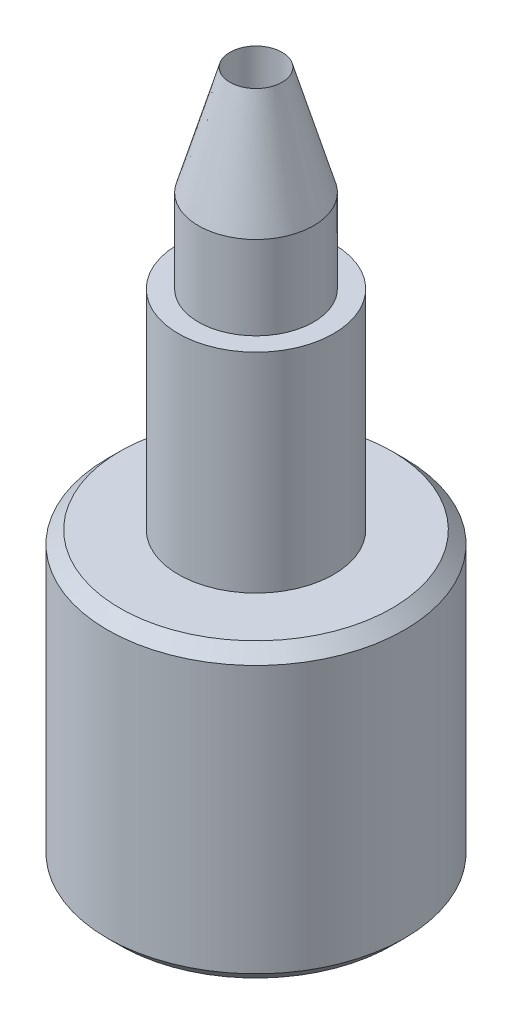
ISO-10303-21;
HEADER;
FILE_DESCRIPTION(('STEP AP214'),'2;1');
FILE_NAME('part.step','',(''),(''),'','','');
FILE_SCHEMA(('AUTOMOTIVE_DESIGN { 1 0 10303 214 1 1 1 1 }'));
ENDSEC;
DATA;
#1=APPLICATION_CONTEXT('core data for automotive mechanical design processes');
#2=APPLICATION_PROTOCOL_DEFINITION('international standard','automotive_design',2000,#1);
#3=PRODUCT_CONTEXT('',#1,'mechanical');
#4=PRODUCT('Part','Part','',(#3));
#5=PRODUCT_RELATED_PRODUCT_CATEGORY('part','',(#4));
#6=PRODUCT_DEFINITION_FORMATION('','',#4);
#7=PRODUCT_DEFINITION_CONTEXT('part definition',#1,'design');
#8=PRODUCT_DEFINITION('design','',#6,#7);
#9=PRODUCT_DEFINITION_SHAPE('','',#8);
#10=(LENGTH_UNIT() NAMED_UNIT(*) SI_UNIT(.MILLI.,.METRE.));
#11=(NAMED_UNIT(*) PLANE_ANGLE_UNIT() SI_UNIT($,.RADIAN.));
#12=(NAMED_UNIT(*) SI_UNIT($,.STERADIAN.) SOLID_ANGLE_UNIT());
#13=UNCERTAINTY_MEASURE_WITH_UNIT(LENGTH_MEASURE(1.E-05),#10,'distance_accuracy_value','');
#14=(GEOMETRIC_REPRESENTATION_CONTEXT(3) GLOBAL_UNCERTAINTY_ASSIGNED_CONTEXT((#13)) GLOBAL_UNIT_ASSIGNED_CONTEXT((#10,
#11,#12)) REPRESENTATION_CONTEXT('',''));
#15=CARTESIAN_POINT('',(0.,0.,0.));
#16=DIRECTION('',(0.,0.,1.));
#17=DIRECTION('',(1.,0.,0.));
#18=AXIS2_PLACEMENT_3D('',#15,#16,#17);
#19=CARTESIAN_POINT('',(0.,17.78,0.));
#20=DIRECTION('',(0.,-1.,0.));
#21=DIRECTION('',(0.,0.,-1.));
#22=AXIS2_PLACEMENT_3D('',#19,#20,#21);
#23=CONICAL_SURFACE('',#22,1.7526,0.282612163980481);
#24=CARTESIAN_POINT('',(0.,21.082,0.));
#25=DIRECTION('',(0.,1.,0.));
#26=DIRECTION('',(0.,0.,1.));
#27=AXIS2_PLACEMENT_3D('',#24,#25,#26);
#28=CIRCLE('',#27,0.79375);
#29=CARTESIAN_POINT('',(0.,21.082,0.79375));
#30=VERTEX_POINT('',#29);
#31=EDGE_CURVE('E70',#30,#30,#28,.T.);
#32=ORIENTED_EDGE('',*,*,#31,.F.);
#33=EDGE_LOOP('',(#32));
#34=FACE_BOUND('',#33,.T.);
#35=CARTESIAN_POINT('',(0.,17.78,0.));
#36=DIRECTION('',(0.,-1.,0.));
#37=DIRECTION('',(0.,0.,-1.));
#38=AXIS2_PLACEMENT_3D('',#35,#36,#37);
#39=CIRCLE('',#38,1.7526);
#40=CARTESIAN_POINT('',(0.,17.78,-1.7526));
#41=VERTEX_POINT('',#40);
#42=EDGE_CURVE('E52',#41,#41,#39,.T.);
#43=ORIENTED_EDGE('',*,*,#42,.F.);
#44=EDGE_LOOP('',(#43));
#45=FACE_BOUND('',#44,.T.);
#46=ADVANCED_FACE('F32',(#34,#45),#23,.T.);
#47=CARTESIAN_POINT('',(0.,0.,0.));
#48=DIRECTION('',(0.,-1.,0.));
#49=DIRECTION('',(0.,0.,-1.));
#50=AXIS2_PLACEMENT_3D('',#47,#48,#49);
#51=CYLINDRICAL_SURFACE('',#50,1.7526);
#52=ORIENTED_EDGE('',*,*,#42,.T.);
#53=EDGE_LOOP('',(#52));
#54=FACE_BOUND('',#53,.T.);
#55=CARTESIAN_POINT('',(0.,15.24,0.));
#56=DIRECTION('',(0.,-1.,0.));
#57=DIRECTION('',(0.,0.,-1.));
#58=AXIS2_PLACEMENT_3D('',#55,#56,#57);
#59=CIRCLE('',#58,1.7526);
#60=CARTESIAN_POINT('',(0.,15.24,-1.7526));
#61=VERTEX_POINT('',#60);
#62=EDGE_CURVE('E55',#61,#61,#59,.T.);
#63=ORIENTED_EDGE('',*,*,#62,.F.);
#64=EDGE_LOOP('',(#63));
#65=FACE_BOUND('',#64,.T.);
#66=ADVANCED_FACE('F108',(#54,#65),#51,.T.);
#67=CARTESIAN_POINT('',(1.7526,15.24,0.));
#68=DIRECTION('',(0.,1.,0.));
#69=DIRECTION('',(0.,0.,1.));
#70=AXIS2_PLACEMENT_3D('',#67,#68,#69);
#71=PLANE('',#70);
#72=ORIENTED_EDGE('',*,*,#62,.T.);
#73=EDGE_LOOP('',(#72));
#74=FACE_BOUND('',#73,.T.);
#75=CARTESIAN_POINT('',(0.,15.24,0.));
#76=DIRECTION('',(0.,-1.,0.));
#77=DIRECTION('',(0.,0.,-1.));
#78=AXIS2_PLACEMENT_3D('',#75,#76,#77);
#79=CIRCLE('',#78,2.3622);
#80=CARTESIAN_POINT('',(0.,15.24,-2.3622));
#81=VERTEX_POINT('',#80);
#82=EDGE_CURVE('E58',#81,#81,#79,.T.);
#83=ORIENTED_EDGE('',*,*,#82,.F.);
#84=EDGE_LOOP('',(#83));
#85=FACE_BOUND('',#84,.T.);
#86=ADVANCED_FACE('F113',(#74,#85),#71,.T.);
#87=CARTESIAN_POINT('',(0.,0.,0.));
#88=DIRECTION('',(0.,-1.,0.));
#89=DIRECTION('',(0.,0.,-1.));
#90=AXIS2_PLACEMENT_3D('',#87,#88,#89);
#91=CYLINDRICAL_SURFACE('',#90,2.3622);
#92=ORIENTED_EDGE('',*,*,#82,.T.);
#93=EDGE_LOOP('',(#92));
#94=FACE_BOUND('',#93,.T.);
#95=CARTESIAN_POINT('',(0.,8.89,0.));
#96=DIRECTION('',(0.,-1.,0.));
#97=DIRECTION('',(0.,0.,-1.));
#98=AXIS2_PLACEMENT_3D('',#95,#96,#97);
#99=CIRCLE('',#98,2.3622);
#100=CARTESIAN_POINT('',(0.,8.89,-2.3622));
#101=VERTEX_POINT('',#100);
#102=EDGE_CURVE('E61',#101,#101,#99,.T.);
#103=ORIENTED_EDGE('',*,*,#102,.F.);
#104=EDGE_LOOP('',(#103));
#105=FACE_BOUND('',#104,.T.);
#106=ADVANCED_FACE('F120',(#94,#105),#91,.T.);
#107=CARTESIAN_POINT('',(2.3622,8.89,0.));
#108=DIRECTION('',(0.,1.,0.));
#109=DIRECTION('',(0.,0.,1.));
#110=AXIS2_PLACEMENT_3D('',#107,#108,#109);
#111=PLANE('',#110);
#112=CARTESIAN_POINT('',(0.,8.89,0.));
#113=DIRECTION('',(0.,1.,0.));
#114=DIRECTION('',(0.,0.,1.));
#115=AXIS2_PLACEMENT_3D('',#112,#113,#114);
#116=CIRCLE('',#115,4.14019999999999);
#117=CARTESIAN_POINT('',(0.,8.89,-4.14019999999999));
#118=VERTEX_POINT('',#117);
#119=EDGE_CURVE('E10',#118,#118,#116,.T.);
#120=ORIENTED_EDGE('',*,*,#119,.T.);
#121=EDGE_LOOP('',(#120));
#122=FACE_BOUND('',#121,.T.);
#123=ORIENTED_EDGE('',*,*,#102,.T.);
#124=EDGE_LOOP('',(#123));
#125=FACE_BOUND('',#124,.T.);
#126=ADVANCED_FACE('F124',(#122,#125),#111,.T.);
#127=CARTESIAN_POINT('',(0.,0.,0.));
#128=DIRECTION('',(0.,-1.,0.));
#129=DIRECTION('',(0.,0.,-1.));
#130=AXIS2_PLACEMENT_3D('',#127,#128,#129);
#131=CYLINDRICAL_SURFACE('',#130,4.5212);
#132=CARTESIAN_POINT('',(0.,0.380999999999987,0.));
#133=DIRECTION('',(0.,-1.,0.));
#134=DIRECTION('',(0.,0.,-1.));
#135=AXIS2_PLACEMENT_3D('',#132,#133,#134);
#136=CIRCLE('',#135,4.5212);
#137=CARTESIAN_POINT('',(0.,0.380999999999987,-4.5212));
#138=VERTEX_POINT('',#137);
#139=EDGE_CURVE('E40',#138,#138,#136,.F.);
#140=ORIENTED_EDGE('',*,*,#139,.T.);
#141=EDGE_LOOP('',(#140));
#142=FACE_BOUND('',#141,.T.);
#143=CARTESIAN_POINT('',(0.,8.50899999999999,0.));
#144=DIRECTION('',(0.,1.,0.));
#145=DIRECTION('',(0.,0.,1.));
#146=AXIS2_PLACEMENT_3D('',#143,#144,#145);
#147=CIRCLE('',#146,4.5212);
#148=CARTESIAN_POINT('',(0.,8.50899999999999,-4.5212));
#149=VERTEX_POINT('',#148);
#150=EDGE_CURVE('E44',#149,#149,#147,.F.);
#151=ORIENTED_EDGE('',*,*,#150,.T.);
#152=EDGE_LOOP('',(#151));
#153=FACE_BOUND('',#152,.T.);
#154=ADVANCED_FACE('F95',(#142,#153),#131,.T.);
#155=CARTESIAN_POINT('',(4.5212,0.,0.));
#156=DIRECTION('',(0.,-1.,0.));
#157=DIRECTION('',(0.,0.,-1.));
#158=AXIS2_PLACEMENT_3D('',#155,#156,#157);
#159=PLANE('',#158);
#160=CARTESIAN_POINT('',(0.,0.,0.));
#161=DIRECTION('',(0.,-1.,0.));
#162=DIRECTION('',(0.,0.,-1.));
#163=AXIS2_PLACEMENT_3D('',#160,#161,#162);
#164=CIRCLE('',#163,2.667);
#165=CARTESIAN_POINT('',(0.,0.,-2.667));
#166=VERTEX_POINT('',#165);
#167=EDGE_CURVE('E65',#166,#166,#164,.T.);
#168=ORIENTED_EDGE('',*,*,#167,.F.);
#169=EDGE_LOOP('',(#168));
#170=FACE_BOUND('',#169,.T.);
#171=CARTESIAN_POINT('',(0.,0.,0.));
#172=DIRECTION('',(0.,-1.,0.));
#173=DIRECTION('',(0.,0.,-1.));
#174=AXIS2_PLACEMENT_3D('',#171,#172,#173);
#175=CIRCLE('',#174,4.14020000000001);
#176=CARTESIAN_POINT('',(0.,0.,-4.14020000000001));
#177=VERTEX_POINT('',#176);
#178=EDGE_CURVE('E49',#177,#177,#175,.T.);
#179=ORIENTED_EDGE('',*,*,#178,.T.);
#180=EDGE_LOOP('',(#179));
#181=FACE_BOUND('',#180,.T.);
#182=ADVANCED_FACE('F91',(#170,#181),#159,.T.);
#183=CARTESIAN_POINT('',(0.,0.,0.));
#184=DIRECTION('',(0.,1.,0.));
#185=DIRECTION('',(0.,0.,1.));
#186=AXIS2_PLACEMENT_3D('',#183,#184,#185);
#187=CONICAL_SURFACE('',#186,4.14020000000001,0.785398163397447);
#188=ORIENTED_EDGE('',*,*,#139,.F.);
#189=EDGE_LOOP('',(#188));
#190=FACE_BOUND('',#189,.T.);
#191=ORIENTED_EDGE('',*,*,#178,.F.);
#192=EDGE_LOOP('',(#191));
#193=FACE_BOUND('',#192,.T.);
#194=ADVANCED_FACE('F94',(#190,#193),#187,.T.);
#195=CARTESIAN_POINT('',(0.,8.50899999999999,0.));
#196=DIRECTION('',(0.,-1.,0.));
#197=DIRECTION('',(0.,0.,-1.));
#198=AXIS2_PLACEMENT_3D('',#195,#196,#197);
#199=CONICAL_SURFACE('',#198,4.5212,0.785398163397451);
#200=CARTESIAN_POINT('',(0.,8.89,-4.14019999999999));
#201=CARTESIAN_POINT('',(0.,8.88603125,-4.14416874999999));
#202=CARTESIAN_POINT('',(0.,8.8820625,-4.14813749999999));
#203=CARTESIAN_POINT('',(0.,8.874125,-4.15607499999999));
#204=CARTESIAN_POINT('',(0.,8.87015625,-4.16004374999999));
#205=CARTESIAN_POINT('',(0.,8.86221875,-4.16798125));
#206=CARTESIAN_POINT('',(0.,8.85825,-4.17195));
#207=CARTESIAN_POINT('',(0.,8.8503125,-4.1798875));
#208=CARTESIAN_POINT('',(0.,8.84634375,-4.18385624999999));
#209=CARTESIAN_POINT('',(0.,8.83840625,-4.19179374999999));
#210=CARTESIAN_POINT('',(0.,8.8344375,-4.1957625));
#211=CARTESIAN_POINT('',(0.,8.8265,-4.2037));
#212=CARTESIAN_POINT('',(0.,8.82253125,-4.20766875));
#213=CARTESIAN_POINT('',(0.,8.81459375,-4.21560625));
#214=CARTESIAN_POINT('',(0.,8.810625,-4.219575));
#215=CARTESIAN_POINT('',(0.,8.8026875,-4.2275125));
#216=CARTESIAN_POINT('',(0.,8.79871875,-4.23148125));
#217=CARTESIAN_POINT('',(0.,8.79078124999999,-4.23941875));
#218=CARTESIAN_POINT('',(0.,8.7868125,-4.2433875));
#219=CARTESIAN_POINT('',(0.,8.778875,-4.251325));
#220=CARTESIAN_POINT('',(0.,8.77490625,-4.25529375));
#221=CARTESIAN_POINT('',(0.,8.76696875,-4.26323125));
#222=CARTESIAN_POINT('',(0.,8.76299999999999,-4.2672));
#223=CARTESIAN_POINT('',(0.,8.7550625,-4.2751375));
#224=CARTESIAN_POINT('',(0.,8.75109374999999,-4.27910625));
#225=CARTESIAN_POINT('',(0.,8.74315624999999,-4.28704375));
#226=CARTESIAN_POINT('',(0.,8.73918749999999,-4.2910125));
#227=CARTESIAN_POINT('',(0.,8.73125,-4.29895));
#228=CARTESIAN_POINT('',(0.,8.72728125,-4.30291875));
#229=CARTESIAN_POINT('',(0.,8.71934374999999,-4.31085625));
#230=CARTESIAN_POINT('',(0.,8.71537499999999,-4.314825));
#231=CARTESIAN_POINT('',(0.,8.70743749999999,-4.3227625));
#232=CARTESIAN_POINT('',(0.,8.70346874999999,-4.32673125));
#233=CARTESIAN_POINT('',(0.,8.69553124999999,-4.33466875));
#234=CARTESIAN_POINT('',(0.,8.69156249999999,-4.3386375));
#235=CARTESIAN_POINT('',(0.,8.683625,-4.346575));
#236=CARTESIAN_POINT('',(0.,8.67965624999999,-4.35054375));
#237=CARTESIAN_POINT('',(0.,8.67171874999999,-4.35848125));
#238=CARTESIAN_POINT('',(0.,8.66774999999999,-4.36245));
#239=CARTESIAN_POINT('',(0.,8.65981249999999,-4.3703875));
#240=CARTESIAN_POINT('',(0.,8.65584374999999,-4.37435625));
#241=CARTESIAN_POINT('',(0.,8.64790624999999,-4.38229375));
#242=CARTESIAN_POINT('',(0.,8.64393749999999,-4.3862625));
#243=CARTESIAN_POINT('',(0.,8.63599999999999,-4.3942));
#244=CARTESIAN_POINT('',(0.,8.63203124999999,-4.39816875));
#245=CARTESIAN_POINT('',(0.,8.62409374999999,-4.40610625));
#246=CARTESIAN_POINT('',(0.,8.62012499999999,-4.410075));
#247=CARTESIAN_POINT('',(0.,8.61218749999999,-4.4180125));
#248=CARTESIAN_POINT('',(0.,8.60821874999999,-4.42198125));
#249=CARTESIAN_POINT('',(0.,8.60028124999999,-4.42991875));
#250=CARTESIAN_POINT('',(0.,8.59631249999999,-4.4338875));
#251=CARTESIAN_POINT('',(0.,8.58837499999999,-4.441825));
#252=CARTESIAN_POINT('',(0.,8.58440624999999,-4.44579375));
#253=CARTESIAN_POINT('',(0.,8.57646874999999,-4.45373125));
#254=CARTESIAN_POINT('',(0.,8.57249999999999,-4.4577));
#255=CARTESIAN_POINT('',(0.,8.56456249999999,-4.4656375));
#256=CARTESIAN_POINT('',(0.,8.56059374999999,-4.46960625));
#257=CARTESIAN_POINT('',(0.,8.55265624999999,-4.47754375));
#258=CARTESIAN_POINT('',(0.,8.54868749999999,-4.4815125));
#259=CARTESIAN_POINT('',(0.,8.54074999999999,-4.48945));
#260=CARTESIAN_POINT('',(0.,8.53678124999999,-4.49341875));
#261=CARTESIAN_POINT('',(0.,8.52884374999999,-4.50135625));
#262=CARTESIAN_POINT('',(0.,8.52487499999999,-4.505325));
#263=CARTESIAN_POINT('',(0.,8.51693749999999,-4.5132625));
#264=CARTESIAN_POINT('',(0.,8.51296874999999,-4.51723125));
#265=CARTESIAN_POINT('',(0.,8.50899999999999,-4.5212));
#266=B_SPLINE_CURVE_WITH_KNOTS('',3,(#200,#201,#202,#203,#204,#205,#206,#207,#208,#209,#210,
#211,#212,#213,#214,#215,#216,#217,#218,#219,#220,#221,#222,#223,#224,#225,#226,#227,#228,#229,
#230,#231,#232,#233,#234,#235,#236,#237,#238,#239,#240,#241,#242,#243,#244,#245,#246,#247,#248,
#249,#250,#251,#252,#253,#254,#255,#256,#257,#258,#259,#260,#261,#262,#263,#264,#265),
.UNSPECIFIED.,.F.,.F.,(4,2,2,2,2,2,2,2,2,2,2,2,2,2,2,2,2,2,2,2,2,2,2,2,2,2,2,2,2,2,2,2,4),(0.,
0.0168379802270037,0.0336759604540093,0.0505139406810148,0.0673519209080198,0.0841899011350241,
0.101027881362029,0.117865861589035,0.13470384181604,0.151541822043044,0.168379802270049,
0.185217782497054,0.20205576272406,0.218893742951064,0.235731723178069,0.252569703405074,
0.26940768363208,0.286245663859084,0.303083644086089,0.319921624313094,0.336759604540099,
0.353597584767104,0.370435564994109,0.387273545221114,0.404111525448119,0.420949505675124,
0.437787485902129,0.454625466129134,0.47146344635614,0.488301426583143,0.505139406810149,
0.521977387037154,0.538815367264158),.UNSPECIFIED.);
#267=EDGE_CURVE('BSEAM34',#118,#149,#266,.T.);
#268=ORIENTED_EDGE('',*,*,#119,.F.);
#269=ORIENTED_EDGE('',*,*,#150,.F.);
#270=ORIENTED_EDGE('',*,*,#267,.T.);
#271=ORIENTED_EDGE('',*,*,#267,.F.);
#272=EDGE_LOOP('',(#268,#270,#269,#271));
#273=FACE_BOUND('',#272,.T.);
#274=ADVANCED_FACE('F34',(#273),#199,.T.);
#275=CARTESIAN_POINT('',(0.,6.35,0.));
#276=DIRECTION('',(0.,-1.,0.));
#277=DIRECTION('',(0.,0.,-1.));
#278=AXIS2_PLACEMENT_3D('',#275,#276,#277);
#279=CYLINDRICAL_SURFACE('',#278,2.667);
#280=CARTESIAN_POINT('',(0.,6.35,0.));
#281=DIRECTION('',(0.,-1.,0.));
#282=DIRECTION('',(0.,0.,-1.));
#283=AXIS2_PLACEMENT_3D('',#280,#281,#282);
#284=CIRCLE('',#283,2.667);
#285=CARTESIAN_POINT('',(0.,6.35,-2.667));
#286=VERTEX_POINT('',#285);
#287=EDGE_CURVE('E64',#286,#286,#284,.T.);
#288=ORIENTED_EDGE('',*,*,#287,.F.);
#289=EDGE_LOOP('',(#288));
#290=FACE_BOUND('',#289,.T.);
#291=ORIENTED_EDGE('',*,*,#167,.T.);
#292=EDGE_LOOP('',(#291));
#293=FACE_BOUND('',#292,.T.);
#294=ADVANCED_FACE('F82',(#290,#293),#279,.F.);
#295=CARTESIAN_POINT('',(0.,6.35,0.));
#296=DIRECTION('',(0.,-1.,0.));
#297=DIRECTION('',(0.,0.,-1.));
#298=AXIS2_PLACEMENT_3D('',#295,#296,#297);
#299=PLANE('',#298);
#300=CARTESIAN_POINT('',(0.,6.35,0.));
#301=DIRECTION('',(0.,-1.,0.));
#302=DIRECTION('',(0.,0.,-1.));
#303=AXIS2_PLACEMENT_3D('',#300,#301,#302);
#304=CIRCLE('',#303,0.79375);
#305=CARTESIAN_POINT('',(0.,6.35,0.79375));
#306=VERTEX_POINT('',#305);
#307=EDGE_CURVE('E36',#306,#306,#304,.T.);
#308=ORIENTED_EDGE('',*,*,#307,.F.);
#309=EDGE_LOOP('',(#308));
#310=FACE_BOUND('',#309,.T.);
#311=ORIENTED_EDGE('',*,*,#287,.T.);
#312=EDGE_LOOP('',(#311));
#313=FACE_BOUND('',#312,.T.);
#314=ADVANCED_FACE('F79',(#310,#313),#299,.T.);
#315=CARTESIAN_POINT('',(0.,0.,0.));
#316=DIRECTION('',(0.,1.,0.));
#317=DIRECTION('',(0.,0.,1.));
#318=AXIS2_PLACEMENT_3D('',#315,#316,#317);
#319=CYLINDRICAL_SURFACE('',#318,0.79375);
#320=CARTESIAN_POINT('',(0.,6.35,0.79375));
#321=CARTESIAN_POINT('',(0.,6.50345833333333,0.79375));
#322=CARTESIAN_POINT('',(0.,6.65691666666667,0.79375));
#323=CARTESIAN_POINT('',(0.,6.96383333333333,0.79375));
#324=CARTESIAN_POINT('',(0.,7.11729166666667,0.79375));
#325=CARTESIAN_POINT('',(0.,7.42420833333333,0.79375));
#326=CARTESIAN_POINT('',(0.,7.57766666666667,0.79375));
#327=CARTESIAN_POINT('',(0.,7.88458333333333,0.79375));
#328=CARTESIAN_POINT('',(0.,8.03804166666667,0.79375));
#329=CARTESIAN_POINT('',(0.,8.34495833333333,0.79375));
#330=CARTESIAN_POINT('',(0.,8.49841666666667,0.79375));
#331=CARTESIAN_POINT('',(0.,8.80533333333333,0.79375));
#332=CARTESIAN_POINT('',(0.,8.95879166666667,0.79375));
#333=CARTESIAN_POINT('',(0.,9.26570833333333,0.79375));
#334=CARTESIAN_POINT('',(0.,9.41916666666667,0.79375));
#335=CARTESIAN_POINT('',(0.,9.72608333333333,0.79375));
#336=CARTESIAN_POINT('',(0.,9.87954166666666,0.79375));
#337=CARTESIAN_POINT('',(0.,10.1864583333333,0.79375));
#338=CARTESIAN_POINT('',(0.,10.3399166666667,0.79375));
#339=CARTESIAN_POINT('',(0.,10.6468333333333,0.79375));
#340=CARTESIAN_POINT('',(0.,10.8002916666667,0.79375));
#341=CARTESIAN_POINT('',(0.,11.1072083333333,0.79375));
#342=CARTESIAN_POINT('',(0.,11.2606666666667,0.79375));
#343=CARTESIAN_POINT('',(0.,11.5675833333333,0.79375));
#344=CARTESIAN_POINT('',(0.,11.7210416666667,0.79375));
#345=CARTESIAN_POINT('',(0.,12.0279583333333,0.79375));
#346=CARTESIAN_POINT('',(0.,12.1814166666667,0.79375));
#347=CARTESIAN_POINT('',(0.,12.4883333333333,0.79375));
#348=CARTESIAN_POINT('',(0.,12.6417916666667,0.79375));
#349=CARTESIAN_POINT('',(0.,12.9487083333333,0.79375));
#350=CARTESIAN_POINT('',(0.,13.1021666666667,0.79375));
#351=CARTESIAN_POINT('',(0.,13.4090833333333,0.79375));
#352=CARTESIAN_POINT('',(0.,13.5625416666667,0.79375));
#353=CARTESIAN_POINT('',(0.,13.8694583333333,0.79375));
#354=CARTESIAN_POINT('',(0.,14.0229166666667,0.79375));
#355=CARTESIAN_POINT('',(0.,14.3298333333333,0.79375));
#356=CARTESIAN_POINT('',(0.,14.4832916666667,0.79375));
#357=CARTESIAN_POINT('',(0.,14.7902083333333,0.79375));
#358=CARTESIAN_POINT('',(0.,14.9436666666667,0.79375));
#359=CARTESIAN_POINT('',(0.,15.2505833333333,0.79375));
#360=CARTESIAN_POINT('',(0.,15.4040416666667,0.79375));
#361=CARTESIAN_POINT('',(0.,15.7109583333333,0.79375));
#362=CARTESIAN_POINT('',(0.,15.8644166666667,0.79375));
#363=CARTESIAN_POINT('',(0.,16.1713333333333,0.79375));
#364=CARTESIAN_POINT('',(0.,16.3247916666667,0.79375));
#365=CARTESIAN_POINT('',(0.,16.6317083333333,0.79375));
#366=CARTESIAN_POINT('',(0.,16.7851666666667,0.79375));
#367=CARTESIAN_POINT('',(0.,17.0920833333333,0.79375));
#368=CARTESIAN_POINT('',(0.,17.2455416666667,0.79375));
#369=CARTESIAN_POINT('',(0.,17.5524583333333,0.79375));
#370=CARTESIAN_POINT('',(0.,17.7059166666667,0.79375));
#371=CARTESIAN_POINT('',(0.,18.0128333333333,0.79375));
#372=CARTESIAN_POINT('',(0.,18.1662916666667,0.79375));
#373=CARTESIAN_POINT('',(0.,18.4732083333333,0.79375));
#374=CARTESIAN_POINT('',(0.,18.6266666666667,0.79375));
#375=CARTESIAN_POINT('',(0.,18.9335833333333,0.79375));
#376=CARTESIAN_POINT('',(0.,19.0870416666667,0.79375));
#377=CARTESIAN_POINT('',(0.,19.3939583333333,0.79375));
#378=CARTESIAN_POINT('',(0.,19.5474166666667,0.79375));
#379=CARTESIAN_POINT('',(0.,19.8543333333333,0.79375));
#380=CARTESIAN_POINT('',(0.,20.0077916666667,0.79375));
#381=CARTESIAN_POINT('',(0.,20.3147083333333,0.79375));
#382=CARTESIAN_POINT('',(0.,20.4681666666667,0.79375));
#383=CARTESIAN_POINT('',(0.,20.7750833333333,0.79375));
#384=CARTESIAN_POINT('',(0.,20.9285416666667,0.79375));
#385=CARTESIAN_POINT('',(0.,21.082,0.79375));
#386=B_SPLINE_CURVE_WITH_KNOTS('',3,(#320,#321,#322,#323,#324,#325,#326,#327,#328,#329,#330,
#331,#332,#333,#334,#335,#336,#337,#338,#339,#340,#341,#342,#343,#344,#345,#346,#347,#348,#349,
#350,#351,#352,#353,#354,#355,#356,#357,#358,#359,#360,#361,#362,#363,#364,#365,#366,#367,#368,
#369,#370,#371,#372,#373,#374,#375,#376,#377,#378,#379,#380,#381,#382,#383,#384,#385),
.UNSPECIFIED.,.F.,.F.,(4,2,2,2,2,2,2,2,2,2,2,2,2,2,2,2,2,2,2,2,2,2,2,2,2,2,2,2,2,2,2,2,4),(0.,
0.460375,0.92075,1.381125,1.8415,2.301875,2.76225,3.222625,3.683,4.143375,4.60375,5.064125,
5.5245,5.984875,6.44525,6.905625,7.366,7.826375,8.28675,8.747125,9.2075,9.667875,10.12825,
10.588625,11.049,11.509375,11.96975,12.430125,12.8905,13.350875,13.81125,14.271625,14.732),.UNSPECIFIED.);
#387=EDGE_CURVE('BSEAM77',#306,#30,#386,.T.);
#388=ORIENTED_EDGE('',*,*,#307,.T.);
#389=ORIENTED_EDGE('',*,*,#31,.T.);
#390=ORIENTED_EDGE('',*,*,#387,.T.);
#391=ORIENTED_EDGE('',*,*,#387,.F.);
#392=EDGE_LOOP('',(#388,#390,#389,#391));
#393=FACE_BOUND('',#392,.T.);
#394=ADVANCED_FACE('F77',(#393),#319,.F.);
#395=CLOSED_SHELL('',(#46,#66,#86,#106,#126,#154,#182,#194,#274,#294,#314,#394));
#396=MANIFOLD_SOLID_BREP('B2',#395);
#397=ADVANCED_BREP_SHAPE_REPRESENTATION('',(#18,#396),#14);
#398=SHAPE_DEFINITION_REPRESENTATION(#9,#397);
ENDSEC;
END-ISO-10303-21;
